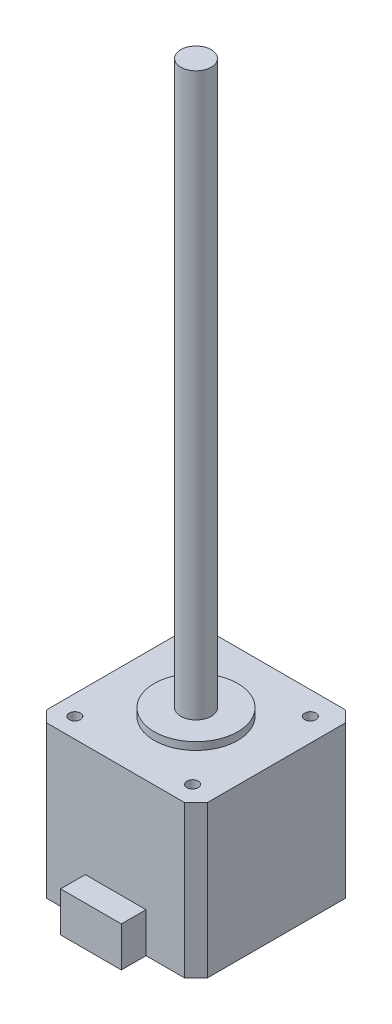
ISO-10303-21;
HEADER;
FILE_DESCRIPTION(('STEP AP214'),'2;1');
FILE_NAME('part.step','',(''),(''),'','','');
FILE_SCHEMA(('AUTOMOTIVE_DESIGN { 1 0 10303 214 1 1 1 1 }'));
ENDSEC;
DATA;
#1=APPLICATION_CONTEXT('core data for automotive mechanical design processes');
#2=APPLICATION_PROTOCOL_DEFINITION('international standard','automotive_design',2000,#1);
#3=PRODUCT_CONTEXT('',#1,'mechanical');
#4=PRODUCT('Part','Part','',(#3));
#5=PRODUCT_RELATED_PRODUCT_CATEGORY('part','',(#4));
#6=PRODUCT_DEFINITION_FORMATION('','',#4);
#7=PRODUCT_DEFINITION_CONTEXT('part definition',#1,'design');
#8=PRODUCT_DEFINITION('design','',#6,#7);
#9=PRODUCT_DEFINITION_SHAPE('','',#8);
#10=(LENGTH_UNIT() NAMED_UNIT(*) SI_UNIT(.MILLI.,.METRE.));
#11=(NAMED_UNIT(*) PLANE_ANGLE_UNIT() SI_UNIT($,.RADIAN.));
#12=(NAMED_UNIT(*) SI_UNIT($,.STERADIAN.) SOLID_ANGLE_UNIT());
#13=UNCERTAINTY_MEASURE_WITH_UNIT(LENGTH_MEASURE(1.E-05),#10,'distance_accuracy_value','');
#14=(GEOMETRIC_REPRESENTATION_CONTEXT(3) GLOBAL_UNCERTAINTY_ASSIGNED_CONTEXT((#13)) GLOBAL_UNIT_ASSIGNED_CONTEXT((#10,
#11,#12)) REPRESENTATION_CONTEXT('',''));
#15=CARTESIAN_POINT('',(0.,0.,0.));
#16=DIRECTION('',(0.,0.,1.));
#17=DIRECTION('',(1.,0.,0.));
#18=AXIS2_PLACEMENT_3D('',#15,#16,#17);
#19=CARTESIAN_POINT('',(-18.15,40.,21.15));
#20=DIRECTION('',(0.,0.,-1.));
#21=DIRECTION('',(-1.,0.,0.));
#22=AXIS2_PLACEMENT_3D('',#19,#20,#21);
#23=PLANE('',#22);
#24=DIRECTION('',(0.,1.,0.));
#25=VECTOR('',#24,1.);
#26=CARTESIAN_POINT('',(8.,0.,21.15));
#27=LINE('',#26,#25);
#28=CARTESIAN_POINT('',(8.,0.,21.15));
#29=VERTEX_POINT('',#28);
#30=CARTESIAN_POINT('',(8.,10.5,21.15));
#31=VERTEX_POINT('',#30);
#32=EDGE_CURVE('E54',#29,#31,#27,.T.);
#33=ORIENTED_EDGE('',*,*,#32,.F.);
#34=DIRECTION('',(1.,0.,0.));
#35=VECTOR('',#34,1.);
#36=CARTESIAN_POINT('',(-18.15,0.,21.15));
#37=LINE('',#36,#35);
#38=CARTESIAN_POINT('',(18.15,0.,21.15));
#39=VERTEX_POINT('',#38);
#40=EDGE_CURVE('E207',#29,#39,#37,.T.);
#41=ORIENTED_EDGE('',*,*,#40,.T.);
#42=DIRECTION('',(0.,-1.,0.));
#43=VECTOR('',#42,1.);
#44=CARTESIAN_POINT('',(18.15,40.,21.15));
#45=LINE('',#44,#43);
#46=CARTESIAN_POINT('',(18.15,40.,21.15));
#47=VERTEX_POINT('',#46);
#48=EDGE_CURVE('E226',#47,#39,#45,.T.);
#49=ORIENTED_EDGE('',*,*,#48,.F.);
#50=DIRECTION('',(1.,0.,0.));
#51=VECTOR('',#50,1.);
#52=CARTESIAN_POINT('',(-18.15,40.,21.15));
#53=LINE('',#52,#51);
#54=CARTESIAN_POINT('',(-18.15,40.,21.15));
#55=VERTEX_POINT('',#54);
#56=EDGE_CURVE('E190',#55,#47,#53,.T.);
#57=ORIENTED_EDGE('',*,*,#56,.F.);
#58=DIRECTION('',(0.,-1.,0.));
#59=VECTOR('',#58,1.);
#60=CARTESIAN_POINT('',(-18.15,40.,21.15));
#61=LINE('',#60,#59);
#62=CARTESIAN_POINT('',(-18.15,0.,21.15));
#63=VERTEX_POINT('',#62);
#64=EDGE_CURVE('E223',#55,#63,#61,.T.);
#65=ORIENTED_EDGE('',*,*,#64,.T.);
#66=CARTESIAN_POINT('',(-8.,0.,21.15));
#67=VERTEX_POINT('',#66);
#68=EDGE_CURVE('E216',#63,#67,#37,.T.);
#69=ORIENTED_EDGE('',*,*,#68,.T.);
#70=DIRECTION('',(0.,-1.,0.));
#71=VECTOR('',#70,1.);
#72=CARTESIAN_POINT('',(-8.,0.,21.15));
#73=LINE('',#72,#71);
#74=CARTESIAN_POINT('',(-8.,10.5,21.15));
#75=VERTEX_POINT('',#74);
#76=EDGE_CURVE('E140',#75,#67,#73,.T.);
#77=ORIENTED_EDGE('',*,*,#76,.F.);
#78=DIRECTION('',(-1.,0.,0.));
#79=VECTOR('',#78,1.);
#80=CARTESIAN_POINT('',(-8.,10.5,21.15));
#81=LINE('',#80,#79);
#82=EDGE_CURVE('E49',#31,#75,#81,.T.);
#83=ORIENTED_EDGE('',*,*,#82,.F.);
#84=EDGE_LOOP('',(#33,#41,#49,#57,#65,#69,#77,#83));
#85=FACE_BOUND('',#84,.T.);
#86=ADVANCED_FACE('F32',(#85),#23,.F.);
#87=CARTESIAN_POINT('',(-21.15,40.,-18.15));
#88=DIRECTION('',(0.707106781186548,0.,0.707106781186548));
#89=DIRECTION('',(0.707106781186548,0.,-0.707106781186548));
#90=AXIS2_PLACEMENT_3D('',#87,#88,#89);
#91=PLANE('',#90);
#92=DIRECTION('',(-0.707106781186548,0.,0.707106781186548));
#93=VECTOR('',#92,1.);
#94=CARTESIAN_POINT('',(-21.15,0.,-18.15));
#95=LINE('',#94,#93);
#96=CARTESIAN_POINT('',(-18.15,0.,-21.15));
#97=VERTEX_POINT('',#96);
#98=CARTESIAN_POINT('',(-21.15,0.,-18.15));
#99=VERTEX_POINT('',#98);
#100=EDGE_CURVE('E179',#97,#99,#95,.T.);
#101=ORIENTED_EDGE('',*,*,#100,.T.);
#102=DIRECTION('',(0.,-1.,0.));
#103=VECTOR('',#102,1.);
#104=CARTESIAN_POINT('',(-21.15,40.,-18.15));
#105=LINE('',#104,#103);
#106=CARTESIAN_POINT('',(-21.15,40.,-18.15));
#107=VERTEX_POINT('',#106);
#108=EDGE_CURVE('E41',#107,#99,#105,.T.);
#109=ORIENTED_EDGE('',*,*,#108,.F.);
#110=DIRECTION('',(-0.707106781186548,0.,0.707106781186548));
#111=VECTOR('',#110,1.);
#112=CARTESIAN_POINT('',(-21.15,40.,-18.15));
#113=LINE('',#112,#111);
#114=CARTESIAN_POINT('',(-18.15,40.,-21.15));
#115=VERTEX_POINT('',#114);
#116=EDGE_CURVE('E182',#115,#107,#113,.T.);
#117=ORIENTED_EDGE('',*,*,#116,.F.);
#118=DIRECTION('',(0.,-1.,0.));
#119=VECTOR('',#118,1.);
#120=CARTESIAN_POINT('',(-18.15,40.,-21.15));
#121=LINE('',#120,#119);
#122=EDGE_CURVE('E200',#115,#97,#121,.T.);
#123=ORIENTED_EDGE('',*,*,#122,.T.);
#124=EDGE_LOOP('',(#101,#109,#117,#123));
#125=FACE_BOUND('',#124,.T.);
#126=ADVANCED_FACE('F34',(#125),#91,.F.);
#127=CARTESIAN_POINT('',(-21.15,40.,18.15));
#128=DIRECTION('',(1.,0.,0.));
#129=DIRECTION('',(0.,0.,-1.));
#130=AXIS2_PLACEMENT_3D('',#127,#128,#129);
#131=PLANE('',#130);
#132=DIRECTION('',(0.,0.,1.));
#133=VECTOR('',#132,1.);
#134=CARTESIAN_POINT('',(-21.15,0.,18.15));
#135=LINE('',#134,#133);
#136=CARTESIAN_POINT('',(-21.15,0.,18.15));
#137=VERTEX_POINT('',#136);
#138=EDGE_CURVE('E203',#99,#137,#135,.T.);
#139=ORIENTED_EDGE('',*,*,#138,.T.);
#140=DIRECTION('',(0.,-1.,0.));
#141=VECTOR('',#140,1.);
#142=CARTESIAN_POINT('',(-21.15,40.,18.15));
#143=LINE('',#142,#141);
#144=CARTESIAN_POINT('',(-21.15,40.,18.15));
#145=VERTEX_POINT('',#144);
#146=EDGE_CURVE('E220',#145,#137,#143,.T.);
#147=ORIENTED_EDGE('',*,*,#146,.F.);
#148=DIRECTION('',(0.,0.,1.));
#149=VECTOR('',#148,1.);
#150=CARTESIAN_POINT('',(-21.15,40.,18.15));
#151=LINE('',#150,#149);
#152=EDGE_CURVE('E185',#107,#145,#151,.T.);
#153=ORIENTED_EDGE('',*,*,#152,.F.);
#154=ORIENTED_EDGE('',*,*,#108,.T.);
#155=EDGE_LOOP('',(#139,#147,#153,#154));
#156=FACE_BOUND('',#155,.T.);
#157=ADVANCED_FACE('F296',(#156),#131,.F.);
#158=CARTESIAN_POINT('',(-21.15,40.,18.15));
#159=DIRECTION('',(0.707106781186548,0.,-0.707106781186548));
#160=DIRECTION('',(-0.707106781186548,0.,-0.707106781186548));
#161=AXIS2_PLACEMENT_3D('',#158,#159,#160);
#162=PLANE('',#161);
#163=DIRECTION('',(0.707106781186548,0.,0.707106781186548));
#164=VECTOR('',#163,1.);
#165=CARTESIAN_POINT('',(-21.15,0.,18.15));
#166=LINE('',#165,#164);
#167=EDGE_CURVE('E205',#137,#63,#166,.T.);
#168=ORIENTED_EDGE('',*,*,#167,.T.);
#169=ORIENTED_EDGE('',*,*,#64,.F.);
#170=DIRECTION('',(0.707106781186548,0.,0.707106781186548));
#171=VECTOR('',#170,1.);
#172=CARTESIAN_POINT('',(-21.15,40.,18.15));
#173=LINE('',#172,#171);
#174=EDGE_CURVE('E188',#145,#55,#173,.T.);
#175=ORIENTED_EDGE('',*,*,#174,.F.);
#176=ORIENTED_EDGE('',*,*,#146,.T.);
#177=EDGE_LOOP('',(#168,#169,#175,#176));
#178=FACE_BOUND('',#177,.T.);
#179=ADVANCED_FACE('F293',(#178),#162,.F.);
#180=CARTESIAN_POINT('',(18.15,40.,21.15));
#181=DIRECTION('',(-0.707106781186548,0.,-0.707106781186548));
#182=DIRECTION('',(-0.707106781186548,0.,0.707106781186548));
#183=AXIS2_PLACEMENT_3D('',#180,#181,#182);
#184=PLANE('',#183);
#185=DIRECTION('',(0.707106781186548,0.,-0.707106781186548));
#186=VECTOR('',#185,1.);
#187=CARTESIAN_POINT('',(18.15,0.,21.15));
#188=LINE('',#187,#186);
#189=CARTESIAN_POINT('',(21.15,0.,18.15));
#190=VERTEX_POINT('',#189);
#191=EDGE_CURVE('E210',#39,#190,#188,.T.);
#192=ORIENTED_EDGE('',*,*,#191,.T.);
#193=DIRECTION('',(0.,-1.,0.));
#194=VECTOR('',#193,1.);
#195=CARTESIAN_POINT('',(21.15,40.,18.15));
#196=LINE('',#195,#194);
#197=CARTESIAN_POINT('',(21.15,40.,18.15));
#198=VERTEX_POINT('',#197);
#199=EDGE_CURVE('E229',#198,#190,#196,.T.);
#200=ORIENTED_EDGE('',*,*,#199,.F.);
#201=DIRECTION('',(0.707106781186548,0.,-0.707106781186548));
#202=VECTOR('',#201,1.);
#203=CARTESIAN_POINT('',(18.15,40.,21.15));
#204=LINE('',#203,#202);
#205=EDGE_CURVE('E192',#47,#198,#204,.T.);
#206=ORIENTED_EDGE('',*,*,#205,.F.);
#207=ORIENTED_EDGE('',*,*,#48,.T.);
#208=EDGE_LOOP('',(#192,#200,#206,#207));
#209=FACE_BOUND('',#208,.T.);
#210=ADVANCED_FACE('F249',(#209),#184,.F.);
#211=CARTESIAN_POINT('',(21.15,40.,18.15));
#212=DIRECTION('',(-1.,0.,0.));
#213=DIRECTION('',(0.,0.,1.));
#214=AXIS2_PLACEMENT_3D('',#211,#212,#213);
#215=PLANE('',#214);
#216=DIRECTION('',(0.,0.,-1.));
#217=VECTOR('',#216,1.);
#218=CARTESIAN_POINT('',(21.15,0.,18.15));
#219=LINE('',#218,#217);
#220=CARTESIAN_POINT('',(21.15,0.,-18.15));
#221=VERTEX_POINT('',#220);
#222=EDGE_CURVE('E242',#190,#221,#219,.T.);
#223=ORIENTED_EDGE('',*,*,#222,.T.);
#224=DIRECTION('',(0.,-1.,0.));
#225=VECTOR('',#224,1.);
#226=CARTESIAN_POINT('',(21.15,40.,-18.15));
#227=LINE('',#226,#225);
#228=CARTESIAN_POINT('',(21.15,40.,-18.15));
#229=VERTEX_POINT('',#228);
#230=EDGE_CURVE('E232',#229,#221,#227,.T.);
#231=ORIENTED_EDGE('',*,*,#230,.F.);
#232=DIRECTION('',(0.,0.,-1.));
#233=VECTOR('',#232,1.);
#234=CARTESIAN_POINT('',(21.15,40.,18.15));
#235=LINE('',#234,#233);
#236=EDGE_CURVE('E194',#198,#229,#235,.T.);
#237=ORIENTED_EDGE('',*,*,#236,.F.);
#238=ORIENTED_EDGE('',*,*,#199,.T.);
#239=EDGE_LOOP('',(#223,#231,#237,#238));
#240=FACE_BOUND('',#239,.T.);
#241=ADVANCED_FACE('F254',(#240),#215,.F.);
#242=CARTESIAN_POINT('',(18.15,40.,-21.15));
#243=DIRECTION('',(-0.707106781186548,0.,0.707106781186548));
#244=DIRECTION('',(0.707106781186548,0.,0.707106781186548));
#245=AXIS2_PLACEMENT_3D('',#242,#243,#244);
#246=PLANE('',#245);
#247=DIRECTION('',(-0.707106781186548,0.,-0.707106781186548));
#248=VECTOR('',#247,1.);
#249=CARTESIAN_POINT('',(18.15,0.,-21.15));
#250=LINE('',#249,#248);
#251=CARTESIAN_POINT('',(18.15,0.,-21.15));
#252=VERTEX_POINT('',#251);
#253=EDGE_CURVE('E241',#221,#252,#250,.T.);
#254=ORIENTED_EDGE('',*,*,#253,.T.);
#255=DIRECTION('',(0.,-1.,0.));
#256=VECTOR('',#255,1.);
#257=CARTESIAN_POINT('',(18.15,40.,-21.15));
#258=LINE('',#257,#256);
#259=CARTESIAN_POINT('',(18.15,40.,-21.15));
#260=VERTEX_POINT('',#259);
#261=EDGE_CURVE('E235',#260,#252,#258,.T.);
#262=ORIENTED_EDGE('',*,*,#261,.F.);
#263=DIRECTION('',(-0.707106781186548,0.,-0.707106781186548));
#264=VECTOR('',#263,1.);
#265=CARTESIAN_POINT('',(18.15,40.,-21.15));
#266=LINE('',#265,#264);
#267=EDGE_CURVE('E196',#229,#260,#266,.T.);
#268=ORIENTED_EDGE('',*,*,#267,.F.);
#269=ORIENTED_EDGE('',*,*,#230,.T.);
#270=EDGE_LOOP('',(#254,#262,#268,#269));
#271=FACE_BOUND('',#270,.T.);
#272=ADVANCED_FACE('F261',(#271),#246,.F.);
#273=CARTESIAN_POINT('',(-18.15,40.,-21.15));
#274=DIRECTION('',(0.,0.,1.));
#275=DIRECTION('',(1.,0.,0.));
#276=AXIS2_PLACEMENT_3D('',#273,#274,#275);
#277=PLANE('',#276);
#278=DIRECTION('',(-1.,0.,0.));
#279=VECTOR('',#278,1.);
#280=CARTESIAN_POINT('',(-18.15,0.,-21.15));
#281=LINE('',#280,#279);
#282=EDGE_CURVE('E186',#252,#97,#281,.T.);
#283=ORIENTED_EDGE('',*,*,#282,.T.);
#284=ORIENTED_EDGE('',*,*,#122,.F.);
#285=DIRECTION('',(-1.,0.,0.));
#286=VECTOR('',#285,1.);
#287=CARTESIAN_POINT('',(-18.15,40.,-21.15));
#288=LINE('',#287,#286);
#289=EDGE_CURVE('E198',#260,#115,#288,.T.);
#290=ORIENTED_EDGE('',*,*,#289,.F.);
#291=ORIENTED_EDGE('',*,*,#261,.T.);
#292=EDGE_LOOP('',(#283,#284,#290,#291));
#293=FACE_BOUND('',#292,.T.);
#294=ADVANCED_FACE('F265',(#293),#277,.F.);
#295=CARTESIAN_POINT('',(0.,40.,0.));
#296=DIRECTION('',(0.,-1.,0.));
#297=DIRECTION('',(0.,0.,-1.));
#298=AXIS2_PLACEMENT_3D('',#295,#296,#297);
#299=PLANE('',#298);
#300=CARTESIAN_POINT('',(0.,40.,0.));
#301=DIRECTION('',(0.,-1.,0.));
#302=DIRECTION('',(0.,0.,-1.));
#303=AXIS2_PLACEMENT_3D('',#300,#301,#302);
#304=CIRCLE('',#303,11.);
#305=CARTESIAN_POINT('',(0.,40.,-11.));
#306=VERTEX_POINT('',#305);
#307=EDGE_CURVE('E11',#306,#306,#304,.F.);
#308=ORIENTED_EDGE('',*,*,#307,.F.);
#309=EDGE_LOOP('',(#308));
#310=FACE_BOUND('',#309,.T.);
#311=CARTESIAN_POINT('',(15.0500000000003,40.,15.95));
#312=DIRECTION('',(0.,1.,0.));
#313=DIRECTION('',(0.,0.,1.));
#314=AXIS2_PLACEMENT_3D('',#311,#312,#313);
#315=CIRCLE('',#314,1.5);
#316=CARTESIAN_POINT('',(15.0500000000003,40.,17.45));
#317=VERTEX_POINT('',#316);
#318=EDGE_CURVE('E157',#317,#317,#315,.T.);
#319=ORIENTED_EDGE('',*,*,#318,.F.);
#320=EDGE_LOOP('',(#319));
#321=FACE_BOUND('',#320,.T.);
#322=CARTESIAN_POINT('',(-15.9499999999997,40.,15.9500000000002));
#323=DIRECTION('',(0.,1.,0.));
#324=DIRECTION('',(0.,0.,1.));
#325=AXIS2_PLACEMENT_3D('',#322,#323,#324);
#326=CIRCLE('',#325,1.5);
#327=CARTESIAN_POINT('',(-15.9499999999997,40.,17.4500000000002));
#328=VERTEX_POINT('',#327);
#329=EDGE_CURVE('E161',#328,#328,#326,.T.);
#330=ORIENTED_EDGE('',*,*,#329,.F.);
#331=EDGE_LOOP('',(#330));
#332=FACE_BOUND('',#331,.T.);
#333=CARTESIAN_POINT('',(-15.95,40.,-15.0499999999998));
#334=DIRECTION('',(0.,1.,0.));
#335=DIRECTION('',(0.,0.,1.));
#336=AXIS2_PLACEMENT_3D('',#333,#334,#335);
#337=CIRCLE('',#336,1.5);
#338=CARTESIAN_POINT('',(-15.95,40.,-13.5499999999998));
#339=VERTEX_POINT('',#338);
#340=EDGE_CURVE('E167',#339,#339,#337,.T.);
#341=ORIENTED_EDGE('',*,*,#340,.F.);
#342=EDGE_LOOP('',(#341));
#343=FACE_BOUND('',#342,.T.);
#344=CARTESIAN_POINT('',(15.05,40.,-15.05));
#345=DIRECTION('',(0.,1.,0.));
#346=DIRECTION('',(0.,0.,1.));
#347=AXIS2_PLACEMENT_3D('',#344,#345,#346);
#348=CIRCLE('',#347,1.5);
#349=CARTESIAN_POINT('',(15.05,40.,-13.55));
#350=VERTEX_POINT('',#349);
#351=EDGE_CURVE('E173',#350,#350,#348,.T.);
#352=ORIENTED_EDGE('',*,*,#351,.F.);
#353=EDGE_LOOP('',(#352));
#354=FACE_BOUND('',#353,.T.);
#355=ORIENTED_EDGE('',*,*,#116,.T.);
#356=ORIENTED_EDGE('',*,*,#152,.T.);
#357=ORIENTED_EDGE('',*,*,#174,.T.);
#358=ORIENTED_EDGE('',*,*,#56,.T.);
#359=ORIENTED_EDGE('',*,*,#205,.T.);
#360=ORIENTED_EDGE('',*,*,#236,.T.);
#361=ORIENTED_EDGE('',*,*,#267,.T.);
#362=ORIENTED_EDGE('',*,*,#289,.T.);
#363=EDGE_LOOP('',(#355,#356,#357,#358,#359,#360,#361,#362));
#364=FACE_BOUND('',#363,.T.);
#365=ADVANCED_FACE('F269',(#310,#321,#332,#343,#354,#364),#299,.F.);
#366=CARTESIAN_POINT('',(0.,0.,0.));
#367=DIRECTION('',(0.,-1.,0.));
#368=DIRECTION('',(0.,0.,-1.));
#369=AXIS2_PLACEMENT_3D('',#366,#367,#368);
#370=PLANE('',#369);
#371=ORIENTED_EDGE('',*,*,#100,.F.);
#372=ORIENTED_EDGE('',*,*,#282,.F.);
#373=ORIENTED_EDGE('',*,*,#253,.F.);
#374=ORIENTED_EDGE('',*,*,#222,.F.);
#375=ORIENTED_EDGE('',*,*,#191,.F.);
#376=ORIENTED_EDGE('',*,*,#40,.F.);
#377=DIRECTION('',(0.,0.,-1.));
#378=VECTOR('',#377,1.);
#379=CARTESIAN_POINT('',(8.,0.,27.65));
#380=LINE('',#379,#378);
#381=CARTESIAN_POINT('',(8.,0.,27.65));
#382=VERTEX_POINT('',#381);
#383=EDGE_CURVE('E274',#382,#29,#380,.T.);
#384=ORIENTED_EDGE('',*,*,#383,.F.);
#385=DIRECTION('',(1.,0.,0.));
#386=VECTOR('',#385,1.);
#387=CARTESIAN_POINT('',(-8.,0.,27.65));
#388=LINE('',#387,#386);
#389=CARTESIAN_POINT('',(-8.,0.,27.65));
#390=VERTEX_POINT('',#389);
#391=EDGE_CURVE('E136',#390,#382,#388,.T.);
#392=ORIENTED_EDGE('',*,*,#391,.F.);
#393=DIRECTION('',(0.,0.,-1.));
#394=VECTOR('',#393,1.);
#395=CARTESIAN_POINT('',(-8.,0.,27.65));
#396=LINE('',#395,#394);
#397=EDGE_CURVE('E148',#390,#67,#396,.T.);
#398=ORIENTED_EDGE('',*,*,#397,.T.);
#399=ORIENTED_EDGE('',*,*,#68,.F.);
#400=ORIENTED_EDGE('',*,*,#167,.F.);
#401=ORIENTED_EDGE('',*,*,#138,.F.);
#402=EDGE_LOOP('',(#371,#372,#373,#374,#375,#376,#384,#392,#398,#399,#400,#401));
#403=FACE_BOUND('',#402,.T.);
#404=ADVANCED_FACE('F257',(#403),#370,.T.);
#405=CARTESIAN_POINT('',(15.05,35.5,-15.05));
#406=DIRECTION('',(0.,1.,0.));
#407=DIRECTION('',(0.,0.,1.));
#408=AXIS2_PLACEMENT_3D('',#405,#406,#407);
#409=CYLINDRICAL_SURFACE('',#408,1.5);
#410=CARTESIAN_POINT('',(15.05,35.5,-15.05));
#411=DIRECTION('',(0.,1.,0.));
#412=DIRECTION('',(0.,0.,1.));
#413=AXIS2_PLACEMENT_3D('',#410,#411,#412);
#414=CIRCLE('',#413,1.5);
#415=CARTESIAN_POINT('',(15.05,35.5,-13.55));
#416=VERTEX_POINT('',#415);
#417=EDGE_CURVE('E176',#416,#416,#414,.T.);
#418=ORIENTED_EDGE('',*,*,#417,.F.);
#419=EDGE_LOOP('',(#418));
#420=FACE_BOUND('',#419,.T.);
#421=ORIENTED_EDGE('',*,*,#351,.T.);
#422=EDGE_LOOP('',(#421));
#423=FACE_BOUND('',#422,.T.);
#424=ADVANCED_FACE('F325',(#420,#423),#409,.F.);
#425=CARTESIAN_POINT('',(15.05,35.5,-15.05));
#426=DIRECTION('',(0.,1.,0.));
#427=DIRECTION('',(0.,0.,1.));
#428=AXIS2_PLACEMENT_3D('',#425,#426,#427);
#429=PLANE('',#428);
#430=ORIENTED_EDGE('',*,*,#417,.T.);
#431=EDGE_LOOP('',(#430));
#432=FACE_BOUND('',#431,.T.);
#433=ADVANCED_FACE('F331',(#432),#429,.T.);
#434=CARTESIAN_POINT('',(-15.95,35.5,-15.0499999999998));
#435=DIRECTION('',(0.,1.,0.));
#436=DIRECTION('',(0.,0.,1.));
#437=AXIS2_PLACEMENT_3D('',#434,#435,#436);
#438=CYLINDRICAL_SURFACE('',#437,1.5);
#439=CARTESIAN_POINT('',(-15.95,35.5,-15.0499999999998));
#440=DIRECTION('',(0.,1.,0.));
#441=DIRECTION('',(0.,0.,1.));
#442=AXIS2_PLACEMENT_3D('',#439,#440,#441);
#443=CIRCLE('',#442,1.5);
#444=CARTESIAN_POINT('',(-15.95,35.5,-13.5499999999998));
#445=VERTEX_POINT('',#444);
#446=EDGE_CURVE('E170',#445,#445,#443,.T.);
#447=ORIENTED_EDGE('',*,*,#446,.F.);
#448=EDGE_LOOP('',(#447));
#449=FACE_BOUND('',#448,.T.);
#450=ORIENTED_EDGE('',*,*,#340,.T.);
#451=EDGE_LOOP('',(#450));
#452=FACE_BOUND('',#451,.T.);
#453=ADVANCED_FACE('F335',(#449,#452),#438,.F.);
#454=CARTESIAN_POINT('',(-15.95,35.5,-15.0499999999998));
#455=DIRECTION('',(0.,1.,0.));
#456=DIRECTION('',(0.,0.,1.));
#457=AXIS2_PLACEMENT_3D('',#454,#455,#456);
#458=PLANE('',#457);
#459=ORIENTED_EDGE('',*,*,#446,.T.);
#460=EDGE_LOOP('',(#459));
#461=FACE_BOUND('',#460,.T.);
#462=ADVANCED_FACE('F339',(#461),#458,.T.);
#463=CARTESIAN_POINT('',(-15.9499999999997,35.5,15.9500000000002));
#464=DIRECTION('',(0.,1.,0.));
#465=DIRECTION('',(0.,0.,1.));
#466=AXIS2_PLACEMENT_3D('',#463,#464,#465);
#467=CYLINDRICAL_SURFACE('',#466,1.5);
#468=CARTESIAN_POINT('',(-15.9499999999997,35.5,15.9500000000002));
#469=DIRECTION('',(0.,1.,0.));
#470=DIRECTION('',(0.,0.,1.));
#471=AXIS2_PLACEMENT_3D('',#468,#469,#470);
#472=CIRCLE('',#471,1.5);
#473=CARTESIAN_POINT('',(-15.9499999999997,35.5,17.4500000000002));
#474=VERTEX_POINT('',#473);
#475=EDGE_CURVE('E164',#474,#474,#472,.T.);
#476=ORIENTED_EDGE('',*,*,#475,.F.);
#477=EDGE_LOOP('',(#476));
#478=FACE_BOUND('',#477,.T.);
#479=ORIENTED_EDGE('',*,*,#329,.T.);
#480=EDGE_LOOP('',(#479));
#481=FACE_BOUND('',#480,.T.);
#482=ADVANCED_FACE('F343',(#478,#481),#467,.F.);
#483=CARTESIAN_POINT('',(-15.9499999999997,35.5,15.9500000000002));
#484=DIRECTION('',(0.,1.,0.));
#485=DIRECTION('',(0.,0.,1.));
#486=AXIS2_PLACEMENT_3D('',#483,#484,#485);
#487=PLANE('',#486);
#488=ORIENTED_EDGE('',*,*,#475,.T.);
#489=EDGE_LOOP('',(#488));
#490=FACE_BOUND('',#489,.T.);
#491=ADVANCED_FACE('F347',(#490),#487,.T.);
#492=CARTESIAN_POINT('',(15.0500000000003,35.5,15.95));
#493=DIRECTION('',(0.,1.,0.));
#494=DIRECTION('',(0.,0.,1.));
#495=AXIS2_PLACEMENT_3D('',#492,#493,#494);
#496=CYLINDRICAL_SURFACE('',#495,1.5);
#497=CARTESIAN_POINT('',(15.0500000000003,35.5,15.95));
#498=DIRECTION('',(0.,1.,0.));
#499=DIRECTION('',(0.,0.,1.));
#500=AXIS2_PLACEMENT_3D('',#497,#498,#499);
#501=CIRCLE('',#500,1.5);
#502=CARTESIAN_POINT('',(15.0500000000003,35.5,17.45));
#503=VERTEX_POINT('',#502);
#504=EDGE_CURVE('E158',#503,#503,#501,.T.);
#505=ORIENTED_EDGE('',*,*,#504,.F.);
#506=EDGE_LOOP('',(#505));
#507=FACE_BOUND('',#506,.T.);
#508=ORIENTED_EDGE('',*,*,#318,.T.);
#509=EDGE_LOOP('',(#508));
#510=FACE_BOUND('',#509,.T.);
#511=ADVANCED_FACE('F351',(#507,#510),#496,.F.);
#512=CARTESIAN_POINT('',(15.0500000000003,35.5,15.95));
#513=DIRECTION('',(0.,1.,0.));
#514=DIRECTION('',(0.,0.,1.));
#515=AXIS2_PLACEMENT_3D('',#512,#513,#514);
#516=PLANE('',#515);
#517=ORIENTED_EDGE('',*,*,#504,.T.);
#518=EDGE_LOOP('',(#517));
#519=FACE_BOUND('',#518,.T.);
#520=ADVANCED_FACE('F355',(#519),#516,.T.);
#521=CARTESIAN_POINT('',(0.,42.,0.));
#522=DIRECTION('',(0.,1.,0.));
#523=DIRECTION('',(0.,0.,1.));
#524=AXIS2_PLACEMENT_3D('',#521,#522,#523);
#525=PLANE('',#524);
#526=CARTESIAN_POINT('',(0.,42.,0.));
#527=DIRECTION('',(0.,1.,0.));
#528=DIRECTION('',(0.,0.,1.));
#529=AXIS2_PLACEMENT_3D('',#526,#527,#528);
#530=CIRCLE('',#529,11.);
#531=CARTESIAN_POINT('',(0.,42.,11.));
#532=VERTEX_POINT('',#531);
#533=EDGE_CURVE('E154',#532,#532,#530,.T.);
#534=ORIENTED_EDGE('',*,*,#533,.T.);
#535=EDGE_LOOP('',(#534));
#536=FACE_BOUND('',#535,.T.);
#537=CARTESIAN_POINT('',(0.,42.,0.));
#538=DIRECTION('',(0.,1.,0.));
#539=DIRECTION('',(0.,0.,1.));
#540=AXIS2_PLACEMENT_3D('',#537,#538,#539);
#541=CIRCLE('',#540,4.);
#542=CARTESIAN_POINT('',(0.,42.,4.));
#543=VERTEX_POINT('',#542);
#544=EDGE_CURVE('E146',#543,#543,#541,.T.);
#545=ORIENTED_EDGE('',*,*,#544,.F.);
#546=EDGE_LOOP('',(#545));
#547=FACE_BOUND('',#546,.T.);
#548=ADVANCED_FACE('F359',(#536,#547),#525,.T.);
#549=CARTESIAN_POINT('',(0.,42.,0.));
#550=DIRECTION('',(0.,-1.,0.));
#551=DIRECTION('',(0.,0.,-1.));
#552=AXIS2_PLACEMENT_3D('',#549,#550,#551);
#553=CYLINDRICAL_SURFACE('',#552,11.);
#554=ORIENTED_EDGE('',*,*,#533,.F.);
#555=EDGE_LOOP('',(#554));
#556=FACE_BOUND('',#555,.T.);
#557=ORIENTED_EDGE('',*,*,#307,.T.);
#558=EDGE_LOOP('',(#557));
#559=FACE_BOUND('',#558,.T.);
#560=ADVANCED_FACE('F361',(#556,#559),#553,.T.);
#561=CARTESIAN_POINT('',(0.,190.,0.));
#562=DIRECTION('',(0.,-1.,0.));
#563=DIRECTION('',(0.,0.,-1.));
#564=AXIS2_PLACEMENT_3D('',#561,#562,#563);
#565=CYLINDRICAL_SURFACE('',#564,4.);
#566=ORIENTED_EDGE('',*,*,#544,.T.);
#567=EDGE_LOOP('',(#566));
#568=FACE_BOUND('',#567,.T.);
#569=CARTESIAN_POINT('',(0.,190.,0.));
#570=DIRECTION('',(0.,1.,0.));
#571=DIRECTION('',(0.,0.,1.));
#572=AXIS2_PLACEMENT_3D('',#569,#570,#571);
#573=CIRCLE('',#572,4.);
#574=CARTESIAN_POINT('',(0.,190.,4.));
#575=VERTEX_POINT('',#574);
#576=EDGE_CURVE('E143',#575,#575,#573,.T.);
#577=ORIENTED_EDGE('',*,*,#576,.F.);
#578=EDGE_LOOP('',(#577));
#579=FACE_BOUND('',#578,.T.);
#580=ADVANCED_FACE('F364',(#568,#579),#565,.T.);
#581=CARTESIAN_POINT('',(0.,190.,0.));
#582=DIRECTION('',(0.,1.,0.));
#583=DIRECTION('',(0.,0.,1.));
#584=AXIS2_PLACEMENT_3D('',#581,#582,#583);
#585=PLANE('',#584);
#586=ORIENTED_EDGE('',*,*,#576,.T.);
#587=EDGE_LOOP('',(#586));
#588=FACE_BOUND('',#587,.T.);
#589=ADVANCED_FACE('F371',(#588),#585,.T.);
#590=CARTESIAN_POINT('',(8.,0.,27.65));
#591=DIRECTION('',(-1.,0.,0.));
#592=DIRECTION('',(0.,0.,1.));
#593=AXIS2_PLACEMENT_3D('',#590,#591,#592);
#594=PLANE('',#593);
#595=ORIENTED_EDGE('',*,*,#32,.T.);
#596=DIRECTION('',(0.,0.,-1.));
#597=VECTOR('',#596,1.);
#598=CARTESIAN_POINT('',(8.,10.5,27.65));
#599=LINE('',#598,#597);
#600=CARTESIAN_POINT('',(8.,10.5,27.65));
#601=VERTEX_POINT('',#600);
#602=EDGE_CURVE('E125',#601,#31,#599,.T.);
#603=ORIENTED_EDGE('',*,*,#602,.F.);
#604=DIRECTION('',(0.,1.,0.));
#605=VECTOR('',#604,1.);
#606=CARTESIAN_POINT('',(8.,0.,27.65));
#607=LINE('',#606,#605);
#608=EDGE_CURVE('E131',#382,#601,#607,.T.);
#609=ORIENTED_EDGE('',*,*,#608,.F.);
#610=ORIENTED_EDGE('',*,*,#383,.T.);
#611=EDGE_LOOP('',(#595,#603,#609,#610));
#612=FACE_BOUND('',#611,.T.);
#613=ADVANCED_FACE('F142',(#612),#594,.F.);
#614=CARTESIAN_POINT('',(-8.,10.5,27.65));
#615=DIRECTION('',(0.,-1.,0.));
#616=DIRECTION('',(0.,0.,-1.));
#617=AXIS2_PLACEMENT_3D('',#614,#615,#616);
#618=PLANE('',#617);
#619=ORIENTED_EDGE('',*,*,#82,.T.);
#620=DIRECTION('',(0.,0.,-1.));
#621=VECTOR('',#620,1.);
#622=CARTESIAN_POINT('',(-8.,10.5,27.65));
#623=LINE('',#622,#621);
#624=CARTESIAN_POINT('',(-8.,10.5,27.65));
#625=VERTEX_POINT('',#624);
#626=EDGE_CURVE('E127',#625,#75,#623,.T.);
#627=ORIENTED_EDGE('',*,*,#626,.F.);
#628=DIRECTION('',(-1.,0.,0.));
#629=VECTOR('',#628,1.);
#630=CARTESIAN_POINT('',(-8.,10.5,27.65));
#631=LINE('',#630,#629);
#632=EDGE_CURVE('E121',#601,#625,#631,.T.);
#633=ORIENTED_EDGE('',*,*,#632,.F.);
#634=ORIENTED_EDGE('',*,*,#602,.T.);
#635=EDGE_LOOP('',(#619,#627,#633,#634));
#636=FACE_BOUND('',#635,.T.);
#637=ADVANCED_FACE('F123',(#636),#618,.F.);
#638=CARTESIAN_POINT('',(-8.,0.,27.65));
#639=DIRECTION('',(1.,0.,0.));
#640=DIRECTION('',(0.,0.,-1.));
#641=AXIS2_PLACEMENT_3D('',#638,#639,#640);
#642=PLANE('',#641);
#643=ORIENTED_EDGE('',*,*,#76,.T.);
#644=ORIENTED_EDGE('',*,*,#397,.F.);
#645=DIRECTION('',(0.,-1.,0.));
#646=VECTOR('',#645,1.);
#647=CARTESIAN_POINT('',(-8.,0.,27.65));
#648=LINE('',#647,#646);
#649=EDGE_CURVE('E130',#625,#390,#648,.T.);
#650=ORIENTED_EDGE('',*,*,#649,.F.);
#651=ORIENTED_EDGE('',*,*,#626,.T.);
#652=EDGE_LOOP('',(#643,#644,#650,#651));
#653=FACE_BOUND('',#652,.T.);
#654=ADVANCED_FACE('F289',(#653),#642,.F.);
#655=CARTESIAN_POINT('',(0.,0.,27.65));
#656=DIRECTION('',(0.,0.,-1.));
#657=DIRECTION('',(-1.,0.,0.));
#658=AXIS2_PLACEMENT_3D('',#655,#656,#657);
#659=PLANE('',#658);
#660=ORIENTED_EDGE('',*,*,#608,.T.);
#661=ORIENTED_EDGE('',*,*,#632,.T.);
#662=ORIENTED_EDGE('',*,*,#649,.T.);
#663=ORIENTED_EDGE('',*,*,#391,.T.);
#664=EDGE_LOOP('',(#660,#661,#662,#663));
#665=FACE_BOUND('',#664,.T.);
#666=ADVANCED_FACE('F134',(#665),#659,.F.);
#667=CLOSED_SHELL('',(#86,#126,#157,#179,#210,#241,#272,#294,#365,#404,#424,#433,#453,#462,#482,
#491,#511,#520,#548,#560,#580,#589,#613,#637,#654,#666));
#668=MANIFOLD_SOLID_BREP('B2',#667);
#669=ADVANCED_BREP_SHAPE_REPRESENTATION('',(#18,#668),#14);
#670=SHAPE_DEFINITION_REPRESENTATION(#9,#669);
ENDSEC;
END-ISO-10303-21;
